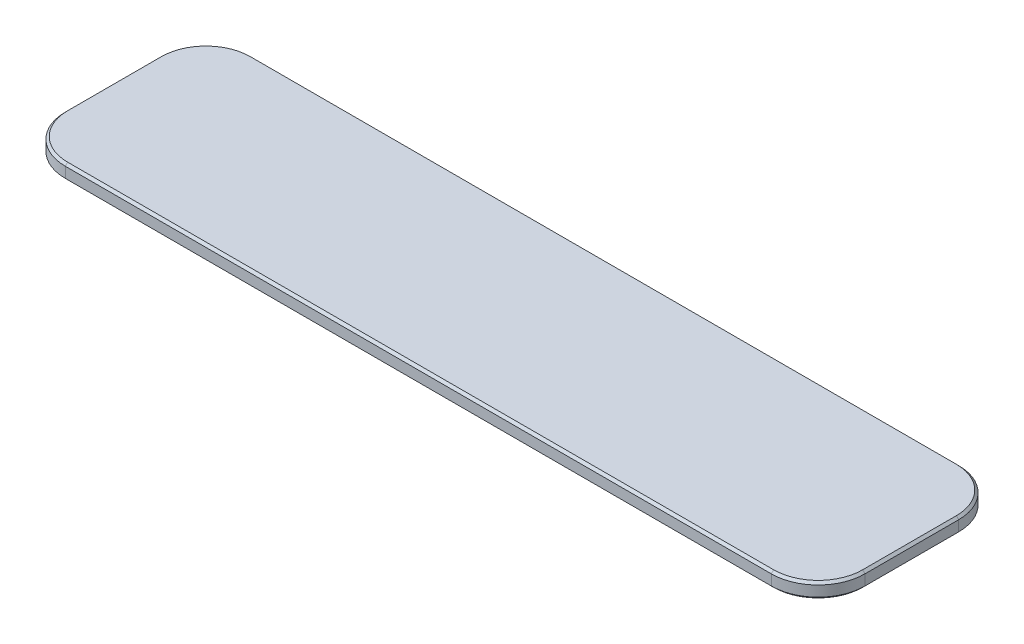
ISO-10303-21;
HEADER;
FILE_DESCRIPTION(('STEP AP214'),'2;1');
FILE_NAME('part.step','',(''),(''),'','','');
FILE_SCHEMA(('AUTOMOTIVE_DESIGN { 1 0 10303 214 1 1 1 1 }'));
ENDSEC;
DATA;
#1=APPLICATION_CONTEXT('core data for automotive mechanical design processes');
#2=APPLICATION_PROTOCOL_DEFINITION('international standard','automotive_design',2000,#1);
#3=PRODUCT_CONTEXT('',#1,'mechanical');
#4=PRODUCT('Part','Part','',(#3));
#5=PRODUCT_RELATED_PRODUCT_CATEGORY('part','',(#4));
#6=PRODUCT_DEFINITION_FORMATION('','',#4);
#7=PRODUCT_DEFINITION_CONTEXT('part definition',#1,'design');
#8=PRODUCT_DEFINITION('design','',#6,#7);
#9=PRODUCT_DEFINITION_SHAPE('','',#8);
#10=(LENGTH_UNIT() NAMED_UNIT(*) SI_UNIT(.MILLI.,.METRE.));
#11=(NAMED_UNIT(*) PLANE_ANGLE_UNIT() SI_UNIT($,.RADIAN.));
#12=(NAMED_UNIT(*) SI_UNIT($,.STERADIAN.) SOLID_ANGLE_UNIT());
#13=UNCERTAINTY_MEASURE_WITH_UNIT(LENGTH_MEASURE(1.E-05),#10,'distance_accuracy_value','');
#14=(GEOMETRIC_REPRESENTATION_CONTEXT(3) GLOBAL_UNCERTAINTY_ASSIGNED_CONTEXT((#13)) GLOBAL_UNIT_ASSIGNED_CONTEXT((#10,
#11,#12)) REPRESENTATION_CONTEXT('',''));
#15=CARTESIAN_POINT('',(0.,0.,0.));
#16=DIRECTION('',(0.,0.,1.));
#17=DIRECTION('',(1.,0.,0.));
#18=AXIS2_PLACEMENT_3D('',#15,#16,#17);
#19=CARTESIAN_POINT('',(170.675,6.5,40.));
#20=DIRECTION('',(-1.,0.,0.));
#21=DIRECTION('',(0.,0.,1.));
#22=AXIS2_PLACEMENT_3D('',#19,#20,#21);
#23=PLANE('',#22);
#24=DIRECTION('',(0.,-1.,0.));
#25=VECTOR('',#24,1.);
#26=CARTESIAN_POINT('',(170.675,6.5,20.));
#27=LINE('',#26,#25);
#28=CARTESIAN_POINT('',(170.675,5.50000000000005,20.));
#29=VERTEX_POINT('',#28);
#30=CARTESIAN_POINT('',(170.675,1.,20.));
#31=VERTEX_POINT('',#30);
#32=EDGE_CURVE('E282',#29,#31,#27,.T.);
#33=ORIENTED_EDGE('',*,*,#32,.T.);
#34=DIRECTION('',(0.,0.,-1.));
#35=VECTOR('',#34,1.);
#36=CARTESIAN_POINT('',(170.675,1.,-20.));
#37=LINE('',#36,#35);
#38=CARTESIAN_POINT('',(170.675,1.,-20.));
#39=VERTEX_POINT('',#38);
#40=EDGE_CURVE('E209',#31,#39,#37,.T.);
#41=ORIENTED_EDGE('',*,*,#40,.T.);
#42=DIRECTION('',(0.,-1.,0.));
#43=VECTOR('',#42,1.);
#44=CARTESIAN_POINT('',(170.675,6.5,-20.));
#45=LINE('',#44,#43);
#46=CARTESIAN_POINT('',(170.675,5.50000000000005,-20.));
#47=VERTEX_POINT('',#46);
#48=EDGE_CURVE('E240',#39,#47,#45,.F.);
#49=ORIENTED_EDGE('',*,*,#48,.T.);
#50=DIRECTION('',(0.,0.,1.));
#51=VECTOR('',#50,1.);
#52=CARTESIAN_POINT('',(170.675,5.50000000000005,40.));
#53=LINE('',#52,#51);
#54=EDGE_CURVE('E207',#47,#29,#53,.T.);
#55=ORIENTED_EDGE('',*,*,#54,.T.);
#56=EDGE_LOOP('',(#33,#41,#49,#55));
#57=FACE_BOUND('',#56,.T.);
#58=ADVANCED_FACE('F34',(#57),#23,.F.);
#59=CARTESIAN_POINT('',(-170.675,6.5,-40.));
#60=DIRECTION('',(0.,0.,1.));
#61=DIRECTION('',(1.,0.,0.));
#62=AXIS2_PLACEMENT_3D('',#59,#60,#61);
#63=PLANE('',#62);
#64=DIRECTION('',(0.,-1.,0.));
#65=VECTOR('',#64,1.);
#66=CARTESIAN_POINT('',(150.675,6.5,-40.));
#67=LINE('',#66,#65);
#68=CARTESIAN_POINT('',(150.675,5.50000000000005,-40.));
#69=VERTEX_POINT('',#68);
#70=CARTESIAN_POINT('',(150.675,1.,-40.));
#71=VERTEX_POINT('',#70);
#72=EDGE_CURVE('E278',#69,#71,#67,.T.);
#73=ORIENTED_EDGE('',*,*,#72,.T.);
#74=DIRECTION('',(-1.,0.,0.));
#75=VECTOR('',#74,1.);
#76=CARTESIAN_POINT('',(-150.675,1.,-40.));
#77=LINE('',#76,#75);
#78=CARTESIAN_POINT('',(-150.675,1.,-40.));
#79=VERTEX_POINT('',#78);
#80=EDGE_CURVE('E184',#71,#79,#77,.T.);
#81=ORIENTED_EDGE('',*,*,#80,.T.);
#82=DIRECTION('',(0.,-1.,0.));
#83=VECTOR('',#82,1.);
#84=CARTESIAN_POINT('',(-150.675,6.5,-40.));
#85=LINE('',#84,#83);
#86=CARTESIAN_POINT('',(-150.675,5.50000000000005,-40.));
#87=VERTEX_POINT('',#86);
#88=EDGE_CURVE('E168',#79,#87,#85,.F.);
#89=ORIENTED_EDGE('',*,*,#88,.T.);
#90=DIRECTION('',(1.,0.,0.));
#91=VECTOR('',#90,1.);
#92=CARTESIAN_POINT('',(-170.675,5.50000000000005,-40.));
#93=LINE('',#92,#91);
#94=EDGE_CURVE('E182',#87,#69,#93,.T.);
#95=ORIENTED_EDGE('',*,*,#94,.T.);
#96=EDGE_LOOP('',(#73,#81,#89,#95));
#97=FACE_BOUND('',#96,.T.);
#98=ADVANCED_FACE('F319',(#97),#63,.F.);
#99=CARTESIAN_POINT('',(-170.675,6.5,40.));
#100=DIRECTION('',(1.,0.,0.));
#101=DIRECTION('',(0.,0.,-1.));
#102=AXIS2_PLACEMENT_3D('',#99,#100,#101);
#103=PLANE('',#102);
#104=DIRECTION('',(0.,-1.,0.));
#105=VECTOR('',#104,1.);
#106=CARTESIAN_POINT('',(-170.675,6.5,-20.));
#107=LINE('',#106,#105);
#108=CARTESIAN_POINT('',(-170.675,5.50000000000005,-20.));
#109=VERTEX_POINT('',#108);
#110=CARTESIAN_POINT('',(-170.675,1.,-20.));
#111=VERTEX_POINT('',#110);
#112=EDGE_CURVE('E295',#109,#111,#107,.T.);
#113=ORIENTED_EDGE('',*,*,#112,.T.);
#114=DIRECTION('',(0.,0.,1.));
#115=VECTOR('',#114,1.);
#116=CARTESIAN_POINT('',(-170.675,1.,20.));
#117=LINE('',#116,#115);
#118=CARTESIAN_POINT('',(-170.675,1.,20.));
#119=VERTEX_POINT('',#118);
#120=EDGE_CURVE('E192',#111,#119,#117,.T.);
#121=ORIENTED_EDGE('',*,*,#120,.T.);
#122=DIRECTION('',(0.,-1.,0.));
#123=VECTOR('',#122,1.);
#124=CARTESIAN_POINT('',(-170.675,6.5,20.));
#125=LINE('',#124,#123);
#126=CARTESIAN_POINT('',(-170.675,5.50000000000005,20.));
#127=VERTEX_POINT('',#126);
#128=EDGE_CURVE('E292',#119,#127,#125,.F.);
#129=ORIENTED_EDGE('',*,*,#128,.T.);
#130=DIRECTION('',(0.,0.,-1.));
#131=VECTOR('',#130,1.);
#132=CARTESIAN_POINT('',(-170.675,5.50000000000005,40.));
#133=LINE('',#132,#131);
#134=EDGE_CURVE('E190',#127,#109,#133,.T.);
#135=ORIENTED_EDGE('',*,*,#134,.T.);
#136=EDGE_LOOP('',(#113,#121,#129,#135));
#137=FACE_BOUND('',#136,.T.);
#138=ADVANCED_FACE('F363',(#137),#103,.F.);
#139=CARTESIAN_POINT('',(-170.675,6.5,40.));
#140=DIRECTION('',(0.,0.,-1.));
#141=DIRECTION('',(-1.,0.,0.));
#142=AXIS2_PLACEMENT_3D('',#139,#140,#141);
#143=PLANE('',#142);
#144=DIRECTION('',(0.,-1.,0.));
#145=VECTOR('',#144,1.);
#146=CARTESIAN_POINT('',(-150.675,6.5,40.));
#147=LINE('',#146,#145);
#148=CARTESIAN_POINT('',(-150.675,5.50000000000005,40.));
#149=VERTEX_POINT('',#148);
#150=CARTESIAN_POINT('',(-150.675,1.,40.));
#151=VERTEX_POINT('',#150);
#152=EDGE_CURVE('E284',#149,#151,#147,.T.);
#153=ORIENTED_EDGE('',*,*,#152,.T.);
#154=DIRECTION('',(1.,0.,0.));
#155=VECTOR('',#154,1.);
#156=CARTESIAN_POINT('',(150.675,1.,40.));
#157=LINE('',#156,#155);
#158=CARTESIAN_POINT('',(150.675,1.,40.));
#159=VERTEX_POINT('',#158);
#160=EDGE_CURVE('E201',#151,#159,#157,.T.);
#161=ORIENTED_EDGE('',*,*,#160,.T.);
#162=DIRECTION('',(0.,-1.,0.));
#163=VECTOR('',#162,1.);
#164=CARTESIAN_POINT('',(150.675,6.5,40.));
#165=LINE('',#164,#163);
#166=CARTESIAN_POINT('',(150.675,5.50000000000005,40.));
#167=VERTEX_POINT('',#166);
#168=EDGE_CURVE('E289',#159,#167,#165,.F.);
#169=ORIENTED_EDGE('',*,*,#168,.T.);
#170=DIRECTION('',(-1.,0.,0.));
#171=VECTOR('',#170,1.);
#172=CARTESIAN_POINT('',(-170.675,5.50000000000005,40.));
#173=LINE('',#172,#171);
#174=EDGE_CURVE('E199',#167,#149,#173,.T.);
#175=ORIENTED_EDGE('',*,*,#174,.T.);
#176=EDGE_LOOP('',(#153,#161,#169,#175));
#177=FACE_BOUND('',#176,.T.);
#178=ADVANCED_FACE('F347',(#177),#143,.F.);
#179=CARTESIAN_POINT('',(0.,6.5,0.));
#180=DIRECTION('',(0.,-1.,0.));
#181=DIRECTION('',(0.,0.,-1.));
#182=AXIS2_PLACEMENT_3D('',#179,#180,#181);
#183=PLANE('',#182);
#184=DIRECTION('',(0.,0.,1.));
#185=VECTOR('',#184,1.);
#186=CARTESIAN_POINT('',(-169.675,6.5,0.));
#187=LINE('',#186,#185);
#188=CARTESIAN_POINT('',(-169.675,6.5,-20.));
#189=VERTEX_POINT('',#188);
#190=CARTESIAN_POINT('',(-169.675,6.5,20.));
#191=VERTEX_POINT('',#190);
#192=EDGE_CURVE('E44',#189,#191,#187,.T.);
#193=ORIENTED_EDGE('',*,*,#192,.T.);
#194=CARTESIAN_POINT('',(-150.675,6.5,20.));
#195=DIRECTION('',(0.,-1.,0.));
#196=DIRECTION('',(0.,0.,-1.));
#197=AXIS2_PLACEMENT_3D('',#194,#195,#196);
#198=CIRCLE('',#197,19.0000000000001);
#199=CARTESIAN_POINT('',(-150.675,6.5,39.0000000000001));
#200=VERTEX_POINT('',#199);
#201=EDGE_CURVE('E11',#191,#200,#198,.F.);
#202=ORIENTED_EDGE('',*,*,#201,.T.);
#203=DIRECTION('',(1.,0.,0.));
#204=VECTOR('',#203,1.);
#205=CARTESIAN_POINT('',(0.,6.5,39.0000000000001));
#206=LINE('',#205,#204);
#207=CARTESIAN_POINT('',(150.675,6.5,39.0000000000001));
#208=VERTEX_POINT('',#207);
#209=EDGE_CURVE('E211',#200,#208,#206,.T.);
#210=ORIENTED_EDGE('',*,*,#209,.T.);
#211=CARTESIAN_POINT('',(150.675,6.5,20.));
#212=DIRECTION('',(0.,-1.,0.));
#213=DIRECTION('',(0.,0.,-1.));
#214=AXIS2_PLACEMENT_3D('',#211,#212,#213);
#215=CIRCLE('',#214,19.);
#216=CARTESIAN_POINT('',(169.675,6.5,20.));
#217=VERTEX_POINT('',#216);
#218=EDGE_CURVE('E213',#208,#217,#215,.F.);
#219=ORIENTED_EDGE('',*,*,#218,.T.);
#220=DIRECTION('',(0.,0.,-1.));
#221=VECTOR('',#220,1.);
#222=CARTESIAN_POINT('',(169.675,6.5,0.));
#223=LINE('',#222,#221);
#224=CARTESIAN_POINT('',(169.675,6.5,-20.));
#225=VERTEX_POINT('',#224);
#226=EDGE_CURVE('E215',#217,#225,#223,.T.);
#227=ORIENTED_EDGE('',*,*,#226,.T.);
#228=CARTESIAN_POINT('',(150.675,6.5,-20.));
#229=DIRECTION('',(0.,-1.,0.));
#230=DIRECTION('',(0.,0.,-1.));
#231=AXIS2_PLACEMENT_3D('',#228,#229,#230);
#232=CIRCLE('',#231,19.0000000000001);
#233=CARTESIAN_POINT('',(150.675,6.5,-39.0000000000001));
#234=VERTEX_POINT('',#233);
#235=EDGE_CURVE('E217',#225,#234,#232,.F.);
#236=ORIENTED_EDGE('',*,*,#235,.T.);
#237=DIRECTION('',(-1.,0.,0.));
#238=VECTOR('',#237,1.);
#239=CARTESIAN_POINT('',(0.,6.5,-39.0000000000001));
#240=LINE('',#239,#238);
#241=CARTESIAN_POINT('',(-150.675,6.5,-39.0000000000001));
#242=VERTEX_POINT('',#241);
#243=EDGE_CURVE('E219',#234,#242,#240,.T.);
#244=ORIENTED_EDGE('',*,*,#243,.T.);
#245=CARTESIAN_POINT('',(-150.675,6.5,-20.));
#246=DIRECTION('',(0.,-1.,0.));
#247=DIRECTION('',(0.,0.,-1.));
#248=AXIS2_PLACEMENT_3D('',#245,#246,#247);
#249=CIRCLE('',#248,19.);
#250=EDGE_CURVE('E55',#242,#189,#249,.F.);
#251=ORIENTED_EDGE('',*,*,#250,.T.);
#252=EDGE_LOOP('',(#193,#202,#210,#219,#227,#236,#244,#251));
#253=FACE_BOUND('',#252,.T.);
#254=ADVANCED_FACE('F335',(#253),#183,.F.);
#255=CARTESIAN_POINT('',(0.,0.,0.));
#256=DIRECTION('',(0.,-1.,0.));
#257=DIRECTION('',(0.,0.,-1.));
#258=AXIS2_PLACEMENT_3D('',#255,#256,#257);
#259=PLANE('',#258);
#260=DIRECTION('',(1.,0.,0.));
#261=VECTOR('',#260,1.);
#262=CARTESIAN_POINT('',(150.675,0.,-39.));
#263=LINE('',#262,#261);
#264=CARTESIAN_POINT('',(-150.675,0.,-39.));
#265=VERTEX_POINT('',#264);
#266=CARTESIAN_POINT('',(150.675,0.,-39.));
#267=VERTEX_POINT('',#266);
#268=EDGE_CURVE('E172',#265,#267,#263,.T.);
#269=ORIENTED_EDGE('',*,*,#268,.T.);
#270=CARTESIAN_POINT('',(150.675,0.,-20.));
#271=DIRECTION('',(0.,-1.,0.));
#272=DIRECTION('',(0.,0.,-1.));
#273=AXIS2_PLACEMENT_3D('',#270,#271,#272);
#274=CIRCLE('',#273,19.);
#275=CARTESIAN_POINT('',(169.675,0.,-20.));
#276=VERTEX_POINT('',#275);
#277=EDGE_CURVE('E153',#267,#276,#274,.T.);
#278=ORIENTED_EDGE('',*,*,#277,.T.);
#279=DIRECTION('',(0.,0.,1.));
#280=VECTOR('',#279,1.);
#281=CARTESIAN_POINT('',(169.675,0.,20.));
#282=LINE('',#281,#280);
#283=CARTESIAN_POINT('',(169.675,0.,20.));
#284=VERTEX_POINT('',#283);
#285=EDGE_CURVE('E161',#276,#284,#282,.T.);
#286=ORIENTED_EDGE('',*,*,#285,.T.);
#287=CARTESIAN_POINT('',(150.675,0.,20.));
#288=DIRECTION('',(0.,-1.,0.));
#289=DIRECTION('',(0.,0.,-1.));
#290=AXIS2_PLACEMENT_3D('',#287,#288,#289);
#291=CIRCLE('',#290,19.);
#292=CARTESIAN_POINT('',(150.675,0.,39.));
#293=VERTEX_POINT('',#292);
#294=EDGE_CURVE('E167',#284,#293,#291,.T.);
#295=ORIENTED_EDGE('',*,*,#294,.T.);
#296=DIRECTION('',(-1.,0.,0.));
#297=VECTOR('',#296,1.);
#298=CARTESIAN_POINT('',(-150.675,0.,39.));
#299=LINE('',#298,#297);
#300=CARTESIAN_POINT('',(-150.675,0.,39.));
#301=VERTEX_POINT('',#300);
#302=EDGE_CURVE('E302',#293,#301,#299,.T.);
#303=ORIENTED_EDGE('',*,*,#302,.T.);
#304=CARTESIAN_POINT('',(-150.675,0.,20.));
#305=DIRECTION('',(0.,-1.,0.));
#306=DIRECTION('',(0.,0.,-1.));
#307=AXIS2_PLACEMENT_3D('',#304,#305,#306);
#308=CIRCLE('',#307,19.);
#309=CARTESIAN_POINT('',(-169.675,0.,20.));
#310=VERTEX_POINT('',#309);
#311=EDGE_CURVE('E304',#301,#310,#308,.T.);
#312=ORIENTED_EDGE('',*,*,#311,.T.);
#313=DIRECTION('',(0.,0.,-1.));
#314=VECTOR('',#313,1.);
#315=CARTESIAN_POINT('',(-169.675,0.,-20.));
#316=LINE('',#315,#314);
#317=CARTESIAN_POINT('',(-169.675,0.,-20.));
#318=VERTEX_POINT('',#317);
#319=EDGE_CURVE('E306',#310,#318,#316,.T.);
#320=ORIENTED_EDGE('',*,*,#319,.T.);
#321=CARTESIAN_POINT('',(-150.675,0.,-20.));
#322=DIRECTION('',(0.,-1.,0.));
#323=DIRECTION('',(0.,0.,-1.));
#324=AXIS2_PLACEMENT_3D('',#321,#322,#323);
#325=CIRCLE('',#324,19.);
#326=EDGE_CURVE('E177',#318,#265,#325,.T.);
#327=ORIENTED_EDGE('',*,*,#326,.T.);
#328=EDGE_LOOP('',(#269,#278,#286,#295,#303,#312,#320,#327));
#329=FACE_BOUND('',#328,.T.);
#330=ADVANCED_FACE('F170',(#329),#259,.T.);
#331=CARTESIAN_POINT('',(150.675,6.5,20.));
#332=DIRECTION('',(0.,-1.,0.));
#333=DIRECTION('',(0.,0.,-1.));
#334=AXIS2_PLACEMENT_3D('',#331,#332,#333);
#335=CYLINDRICAL_SURFACE('',#334,20.);
#336=ORIENTED_EDGE('',*,*,#168,.F.);
#337=CARTESIAN_POINT('',(150.675,1.,20.));
#338=DIRECTION('',(0.,-1.,0.));
#339=DIRECTION('',(0.,0.,-1.));
#340=AXIS2_PLACEMENT_3D('',#337,#338,#339);
#341=CIRCLE('',#340,20.);
#342=EDGE_CURVE('E205',#159,#31,#341,.F.);
#343=ORIENTED_EDGE('',*,*,#342,.T.);
#344=ORIENTED_EDGE('',*,*,#32,.F.);
#345=CARTESIAN_POINT('',(150.675,5.50000000000005,20.));
#346=DIRECTION('',(0.,-1.,0.));
#347=DIRECTION('',(0.,0.,-1.));
#348=AXIS2_PLACEMENT_3D('',#345,#346,#347);
#349=CIRCLE('',#348,20.);
#350=EDGE_CURVE('E203',#29,#167,#349,.T.);
#351=ORIENTED_EDGE('',*,*,#350,.T.);
#352=EDGE_LOOP('',(#336,#343,#344,#351));
#353=FACE_BOUND('',#352,.T.);
#354=ADVANCED_FACE('F377',(#353),#335,.T.);
#355=CARTESIAN_POINT('',(-150.675,6.5,-20.));
#356=DIRECTION('',(0.,-1.,0.));
#357=DIRECTION('',(0.,0.,-1.));
#358=AXIS2_PLACEMENT_3D('',#355,#356,#357);
#359=CYLINDRICAL_SURFACE('',#358,20.);
#360=ORIENTED_EDGE('',*,*,#88,.F.);
#361=CARTESIAN_POINT('',(-150.675,1.,-20.));
#362=DIRECTION('',(0.,-1.,0.));
#363=DIRECTION('',(0.,0.,-1.));
#364=AXIS2_PLACEMENT_3D('',#361,#362,#363);
#365=CIRCLE('',#364,20.);
#366=EDGE_CURVE('E188',#79,#111,#365,.F.);
#367=ORIENTED_EDGE('',*,*,#366,.T.);
#368=ORIENTED_EDGE('',*,*,#112,.F.);
#369=CARTESIAN_POINT('',(-150.675,5.50000000000005,-20.));
#370=DIRECTION('',(0.,-1.,0.));
#371=DIRECTION('',(0.,0.,-1.));
#372=AXIS2_PLACEMENT_3D('',#369,#370,#371);
#373=CIRCLE('',#372,20.);
#374=EDGE_CURVE('E186',#109,#87,#373,.T.);
#375=ORIENTED_EDGE('',*,*,#374,.T.);
#376=EDGE_LOOP('',(#360,#367,#368,#375));
#377=FACE_BOUND('',#376,.T.);
#378=ADVANCED_FACE('F321',(#377),#359,.T.);
#379=CARTESIAN_POINT('',(150.675,6.5,-20.));
#380=DIRECTION('',(0.,-1.,0.));
#381=DIRECTION('',(0.,0.,-1.));
#382=AXIS2_PLACEMENT_3D('',#379,#380,#381);
#383=CYLINDRICAL_SURFACE('',#382,20.);
#384=ORIENTED_EDGE('',*,*,#48,.F.);
#385=CARTESIAN_POINT('',(150.675,1.,-20.));
#386=DIRECTION('',(0.,-1.,0.));
#387=DIRECTION('',(0.,0.,-1.));
#388=AXIS2_PLACEMENT_3D('',#385,#386,#387);
#389=CIRCLE('',#388,20.);
#390=EDGE_CURVE('E155',#39,#71,#389,.F.);
#391=ORIENTED_EDGE('',*,*,#390,.T.);
#392=ORIENTED_EDGE('',*,*,#72,.F.);
#393=CARTESIAN_POINT('',(150.675,5.50000000000005,-20.));
#394=DIRECTION('',(0.,-1.,0.));
#395=DIRECTION('',(0.,0.,-1.));
#396=AXIS2_PLACEMENT_3D('',#393,#394,#395);
#397=CIRCLE('',#396,20.);
#398=EDGE_CURVE('E174',#69,#47,#397,.T.);
#399=ORIENTED_EDGE('',*,*,#398,.T.);
#400=EDGE_LOOP('',(#384,#391,#392,#399));
#401=FACE_BOUND('',#400,.T.);
#402=ADVANCED_FACE('F276',(#401),#383,.T.);
#403=CARTESIAN_POINT('',(-150.675,6.5,20.));
#404=DIRECTION('',(0.,-1.,0.));
#405=DIRECTION('',(0.,0.,-1.));
#406=AXIS2_PLACEMENT_3D('',#403,#404,#405);
#407=CYLINDRICAL_SURFACE('',#406,20.);
#408=ORIENTED_EDGE('',*,*,#128,.F.);
#409=CARTESIAN_POINT('',(-150.675,1.,20.));
#410=DIRECTION('',(0.,-1.,0.));
#411=DIRECTION('',(0.,0.,-1.));
#412=AXIS2_PLACEMENT_3D('',#409,#410,#411);
#413=CIRCLE('',#412,20.);
#414=EDGE_CURVE('E197',#119,#151,#413,.F.);
#415=ORIENTED_EDGE('',*,*,#414,.T.);
#416=ORIENTED_EDGE('',*,*,#152,.F.);
#417=CARTESIAN_POINT('',(-150.675,5.50000000000005,20.));
#418=DIRECTION('',(0.,-1.,0.));
#419=DIRECTION('',(0.,0.,-1.));
#420=AXIS2_PLACEMENT_3D('',#417,#418,#419);
#421=CIRCLE('',#420,20.);
#422=EDGE_CURVE('E194',#149,#127,#421,.T.);
#423=ORIENTED_EDGE('',*,*,#422,.T.);
#424=EDGE_LOOP('',(#408,#415,#416,#423));
#425=FACE_BOUND('',#424,.T.);
#426=ADVANCED_FACE('F352',(#425),#407,.T.);
#427=CARTESIAN_POINT('',(-150.675,0.,20.));
#428=DIRECTION('',(0.,1.,0.));
#429=DIRECTION('',(0.,0.,1.));
#430=AXIS2_PLACEMENT_3D('',#427,#428,#429);
#431=CONICAL_SURFACE('',#430,19.,0.78539816339745);
#432=DIRECTION('',(0.,-0.707106781186545,-0.70710678118655));
#433=VECTOR('',#432,1.);
#434=CARTESIAN_POINT('',(-150.675,1.,40.));
#435=LINE('',#434,#433);
#436=EDGE_CURVE('E234',#151,#301,#435,.T.);
#437=ORIENTED_EDGE('',*,*,#436,.F.);
#438=ORIENTED_EDGE('',*,*,#414,.F.);
#439=DIRECTION('',(-0.707106781186547,0.707106781186547,0.));
#440=VECTOR('',#439,1.);
#441=CARTESIAN_POINT('',(-169.675,0.,20.));
#442=LINE('',#441,#440);
#443=EDGE_CURVE('E237',#310,#119,#442,.T.);
#444=ORIENTED_EDGE('',*,*,#443,.F.);
#445=ORIENTED_EDGE('',*,*,#311,.F.);
#446=EDGE_LOOP('',(#437,#438,#444,#445));
#447=FACE_BOUND('',#446,.T.);
#448=ADVANCED_FACE('F356',(#447),#431,.T.);
#449=CARTESIAN_POINT('',(-170.675,1.,40.));
#450=DIRECTION('',(-0.707106781186547,-0.707106781186547,0.));
#451=DIRECTION('',(0.,0.,-1.));
#452=AXIS2_PLACEMENT_3D('',#449,#450,#451);
#453=PLANE('',#452);
#454=ORIENTED_EDGE('',*,*,#443,.T.);
#455=ORIENTED_EDGE('',*,*,#120,.F.);
#456=DIRECTION('',(-0.707106781186547,0.707106781186547,0.));
#457=VECTOR('',#456,1.);
#458=CARTESIAN_POINT('',(-169.675,0.,-20.));
#459=LINE('',#458,#457);
#460=EDGE_CURVE('E231',#318,#111,#459,.T.);
#461=ORIENTED_EDGE('',*,*,#460,.F.);
#462=ORIENTED_EDGE('',*,*,#319,.F.);
#463=EDGE_LOOP('',(#454,#455,#461,#462));
#464=FACE_BOUND('',#463,.T.);
#465=ADVANCED_FACE('F361',(#464),#453,.T.);
#466=CARTESIAN_POINT('',(-170.675,1.,40.));
#467=DIRECTION('',(0.,-0.707106781186547,0.707106781186547));
#468=DIRECTION('',(-1.,0.,0.));
#469=AXIS2_PLACEMENT_3D('',#466,#467,#468);
#470=PLANE('',#469);
#471=ORIENTED_EDGE('',*,*,#436,.T.);
#472=ORIENTED_EDGE('',*,*,#302,.F.);
#473=DIRECTION('',(0.,-0.707106781186547,-0.707106781186547));
#474=VECTOR('',#473,1.);
#475=CARTESIAN_POINT('',(150.675,1.,40.));
#476=LINE('',#475,#474);
#477=EDGE_CURVE('E228',#159,#293,#476,.T.);
#478=ORIENTED_EDGE('',*,*,#477,.F.);
#479=ORIENTED_EDGE('',*,*,#160,.F.);
#480=EDGE_LOOP('',(#471,#472,#478,#479));
#481=FACE_BOUND('',#480,.T.);
#482=ADVANCED_FACE('F415',(#481),#470,.T.);
#483=CARTESIAN_POINT('',(-150.675,0.,-20.));
#484=DIRECTION('',(0.,1.,0.));
#485=DIRECTION('',(0.,0.,1.));
#486=AXIS2_PLACEMENT_3D('',#483,#484,#485);
#487=CONICAL_SURFACE('',#486,19.,0.785398163397454);
#488=ORIENTED_EDGE('',*,*,#460,.T.);
#489=ORIENTED_EDGE('',*,*,#366,.F.);
#490=DIRECTION('',(0.,0.707106781186545,-0.70710678118655));
#491=VECTOR('',#490,1.);
#492=CARTESIAN_POINT('',(-150.675,0.,-39.));
#493=LINE('',#492,#491);
#494=EDGE_CURVE('E225',#265,#79,#493,.T.);
#495=ORIENTED_EDGE('',*,*,#494,.F.);
#496=ORIENTED_EDGE('',*,*,#326,.F.);
#497=EDGE_LOOP('',(#488,#489,#495,#496));
#498=FACE_BOUND('',#497,.T.);
#499=ADVANCED_FACE('F313',(#498),#487,.T.);
#500=CARTESIAN_POINT('',(150.675,0.,20.));
#501=DIRECTION('',(0.,1.,0.));
#502=DIRECTION('',(0.,0.,1.));
#503=AXIS2_PLACEMENT_3D('',#500,#501,#502);
#504=CONICAL_SURFACE('',#503,19.,0.785398163397454);
#505=ORIENTED_EDGE('',*,*,#477,.T.);
#506=ORIENTED_EDGE('',*,*,#294,.F.);
#507=DIRECTION('',(-0.707106781186547,-0.707106781186547,0.));
#508=VECTOR('',#507,1.);
#509=CARTESIAN_POINT('',(170.675,1.,20.));
#510=LINE('',#509,#508);
#511=EDGE_CURVE('E164',#31,#284,#510,.T.);
#512=ORIENTED_EDGE('',*,*,#511,.F.);
#513=ORIENTED_EDGE('',*,*,#342,.F.);
#514=EDGE_LOOP('',(#505,#506,#512,#513));
#515=FACE_BOUND('',#514,.T.);
#516=ADVANCED_FACE('F403',(#515),#504,.T.);
#517=CARTESIAN_POINT('',(-170.675,1.,-40.));
#518=DIRECTION('',(0.,-0.707106781186547,-0.707106781186547));
#519=DIRECTION('',(1.,0.,0.));
#520=AXIS2_PLACEMENT_3D('',#517,#518,#519);
#521=PLANE('',#520);
#522=ORIENTED_EDGE('',*,*,#494,.T.);
#523=ORIENTED_EDGE('',*,*,#80,.F.);
#524=DIRECTION('',(0.,0.707106781186547,-0.707106781186547));
#525=VECTOR('',#524,1.);
#526=CARTESIAN_POINT('',(150.675,0.,-39.));
#527=LINE('',#526,#525);
#528=EDGE_CURVE('E158',#267,#71,#527,.T.);
#529=ORIENTED_EDGE('',*,*,#528,.F.);
#530=ORIENTED_EDGE('',*,*,#268,.F.);
#531=EDGE_LOOP('',(#522,#523,#529,#530));
#532=FACE_BOUND('',#531,.T.);
#533=ADVANCED_FACE('F316',(#532),#521,.T.);
#534=CARTESIAN_POINT('',(170.675,1.,40.));
#535=DIRECTION('',(0.707106781186547,-0.707106781186547,0.));
#536=DIRECTION('',(0.,0.,1.));
#537=AXIS2_PLACEMENT_3D('',#534,#535,#536);
#538=PLANE('',#537);
#539=ORIENTED_EDGE('',*,*,#511,.T.);
#540=ORIENTED_EDGE('',*,*,#285,.F.);
#541=DIRECTION('',(-0.707106781186547,-0.707106781186547,0.));
#542=VECTOR('',#541,1.);
#543=CARTESIAN_POINT('',(170.675,1.,-20.));
#544=LINE('',#543,#542);
#545=EDGE_CURVE('E149',#39,#276,#544,.T.);
#546=ORIENTED_EDGE('',*,*,#545,.F.);
#547=ORIENTED_EDGE('',*,*,#40,.F.);
#548=EDGE_LOOP('',(#539,#540,#546,#547));
#549=FACE_BOUND('',#548,.T.);
#550=ADVANCED_FACE('F162',(#549),#538,.T.);
#551=CARTESIAN_POINT('',(150.675,0.,-20.));
#552=DIRECTION('',(0.,1.,0.));
#553=DIRECTION('',(0.,0.,1.));
#554=AXIS2_PLACEMENT_3D('',#551,#552,#553);
#555=CONICAL_SURFACE('',#554,19.,0.78539816339745);
#556=ORIENTED_EDGE('',*,*,#528,.T.);
#557=ORIENTED_EDGE('',*,*,#390,.F.);
#558=ORIENTED_EDGE('',*,*,#545,.T.);
#559=ORIENTED_EDGE('',*,*,#277,.F.);
#560=EDGE_LOOP('',(#556,#557,#558,#559));
#561=FACE_BOUND('',#560,.T.);
#562=ADVANCED_FACE('F151',(#561),#555,.T.);
#563=CARTESIAN_POINT('',(150.675,6.5,-20.));
#564=DIRECTION('',(0.,-1.,0.));
#565=DIRECTION('',(0.,0.,-1.));
#566=AXIS2_PLACEMENT_3D('',#563,#564,#565);
#567=CONICAL_SURFACE('',#566,19.0000000000001,0.78539816339745);
#568=DIRECTION('',(-0.707106781186547,0.707106781186547,0.));
#569=VECTOR('',#568,1.);
#570=CARTESIAN_POINT('',(170.675,5.50000000000005,-20.));
#571=LINE('',#570,#569);
#572=EDGE_CURVE('E256',#47,#225,#571,.T.);
#573=ORIENTED_EDGE('',*,*,#572,.F.);
#574=ORIENTED_EDGE('',*,*,#398,.F.);
#575=DIRECTION('',(0.,-0.707106781186547,-0.707106781186547));
#576=VECTOR('',#575,1.);
#577=CARTESIAN_POINT('',(150.675,6.5,-39.0000000000001));
#578=LINE('',#577,#576);
#579=EDGE_CURVE('E39',#234,#69,#578,.T.);
#580=ORIENTED_EDGE('',*,*,#579,.F.);
#581=ORIENTED_EDGE('',*,*,#235,.F.);
#582=EDGE_LOOP('',(#573,#574,#580,#581));
#583=FACE_BOUND('',#582,.T.);
#584=ADVANCED_FACE('F37',(#583),#567,.T.);
#585=CARTESIAN_POINT('',(0.,6.5,-39.0000000000001));
#586=DIRECTION('',(0.,-0.707106781186547,0.707106781186547));
#587=DIRECTION('',(-1.,0.,0.));
#588=AXIS2_PLACEMENT_3D('',#585,#586,#587);
#589=PLANE('',#588);
#590=ORIENTED_EDGE('',*,*,#579,.T.);
#591=ORIENTED_EDGE('',*,*,#94,.F.);
#592=DIRECTION('',(0.,-0.707106781186547,-0.707106781186547));
#593=VECTOR('',#592,1.);
#594=CARTESIAN_POINT('',(-150.675,6.5,-39.0000000000001));
#595=LINE('',#594,#593);
#596=EDGE_CURVE('E254',#242,#87,#595,.T.);
#597=ORIENTED_EDGE('',*,*,#596,.F.);
#598=ORIENTED_EDGE('',*,*,#243,.F.);
#599=EDGE_LOOP('',(#590,#591,#597,#598));
#600=FACE_BOUND('',#599,.T.);
#601=ADVANCED_FACE('F267',(#600),#589,.F.);
#602=CARTESIAN_POINT('',(169.675,6.5,0.));
#603=DIRECTION('',(-0.707106781186547,-0.707106781186547,0.));
#604=DIRECTION('',(0.,0.,-1.));
#605=AXIS2_PLACEMENT_3D('',#602,#603,#604);
#606=PLANE('',#605);
#607=ORIENTED_EDGE('',*,*,#572,.T.);
#608=ORIENTED_EDGE('',*,*,#226,.F.);
#609=DIRECTION('',(-0.707106781186547,0.707106781186547,0.));
#610=VECTOR('',#609,1.);
#611=CARTESIAN_POINT('',(170.675,5.50000000000005,20.));
#612=LINE('',#611,#610);
#613=EDGE_CURVE('E251',#29,#217,#612,.T.);
#614=ORIENTED_EDGE('',*,*,#613,.F.);
#615=ORIENTED_EDGE('',*,*,#54,.F.);
#616=EDGE_LOOP('',(#607,#608,#614,#615));
#617=FACE_BOUND('',#616,.T.);
#618=ADVANCED_FACE('F457',(#617),#606,.F.);
#619=CARTESIAN_POINT('',(-150.675,6.5,-20.));
#620=DIRECTION('',(0.,-1.,0.));
#621=DIRECTION('',(0.,0.,-1.));
#622=AXIS2_PLACEMENT_3D('',#619,#620,#621);
#623=CONICAL_SURFACE('',#622,19.,0.785398163397453);
#624=ORIENTED_EDGE('',*,*,#596,.T.);
#625=ORIENTED_EDGE('',*,*,#374,.F.);
#626=DIRECTION('',(-0.707106781186547,-0.707106781186547,0.));
#627=VECTOR('',#626,1.);
#628=CARTESIAN_POINT('',(-169.675,6.5,-20.));
#629=LINE('',#628,#627);
#630=EDGE_CURVE('E248',#189,#109,#629,.T.);
#631=ORIENTED_EDGE('',*,*,#630,.F.);
#632=ORIENTED_EDGE('',*,*,#250,.F.);
#633=EDGE_LOOP('',(#624,#625,#631,#632));
#634=FACE_BOUND('',#633,.T.);
#635=ADVANCED_FACE('F325',(#634),#623,.T.);
#636=CARTESIAN_POINT('',(150.675,6.5,20.));
#637=DIRECTION('',(0.,-1.,0.));
#638=DIRECTION('',(0.,0.,-1.));
#639=AXIS2_PLACEMENT_3D('',#636,#637,#638);
#640=CONICAL_SURFACE('',#639,19.,0.785398163397453);
#641=ORIENTED_EDGE('',*,*,#613,.T.);
#642=ORIENTED_EDGE('',*,*,#218,.F.);
#643=DIRECTION('',(0.,0.707106781186545,-0.70710678118655));
#644=VECTOR('',#643,1.);
#645=CARTESIAN_POINT('',(150.675,5.50000000000005,40.));
#646=LINE('',#645,#644);
#647=EDGE_CURVE('E245',#167,#208,#646,.T.);
#648=ORIENTED_EDGE('',*,*,#647,.F.);
#649=ORIENTED_EDGE('',*,*,#350,.F.);
#650=EDGE_LOOP('',(#641,#642,#648,#649));
#651=FACE_BOUND('',#650,.T.);
#652=ADVANCED_FACE('F340',(#651),#640,.T.);
#653=CARTESIAN_POINT('',(-169.675,6.5,0.));
#654=DIRECTION('',(0.707106781186547,-0.707106781186547,0.));
#655=DIRECTION('',(0.,0.,1.));
#656=AXIS2_PLACEMENT_3D('',#653,#654,#655);
#657=PLANE('',#656);
#658=ORIENTED_EDGE('',*,*,#630,.T.);
#659=ORIENTED_EDGE('',*,*,#134,.F.);
#660=DIRECTION('',(-0.707106781186547,-0.707106781186547,0.));
#661=VECTOR('',#660,1.);
#662=CARTESIAN_POINT('',(-169.675,6.5,20.));
#663=LINE('',#662,#661);
#664=EDGE_CURVE('E243',#191,#127,#663,.T.);
#665=ORIENTED_EDGE('',*,*,#664,.F.);
#666=ORIENTED_EDGE('',*,*,#192,.F.);
#667=EDGE_LOOP('',(#658,#659,#665,#666));
#668=FACE_BOUND('',#667,.T.);
#669=ADVANCED_FACE('F328',(#668),#657,.F.);
#670=CARTESIAN_POINT('',(0.,6.5,39.0000000000001));
#671=DIRECTION('',(0.,-0.707106781186547,-0.707106781186547));
#672=DIRECTION('',(1.,0.,0.));
#673=AXIS2_PLACEMENT_3D('',#670,#671,#672);
#674=PLANE('',#673);
#675=ORIENTED_EDGE('',*,*,#647,.T.);
#676=ORIENTED_EDGE('',*,*,#209,.F.);
#677=DIRECTION('',(0.,0.707106781186547,-0.707106781186547));
#678=VECTOR('',#677,1.);
#679=CARTESIAN_POINT('',(-150.675,5.50000000000005,40.));
#680=LINE('',#679,#678);
#681=EDGE_CURVE('E241',#149,#200,#680,.T.);
#682=ORIENTED_EDGE('',*,*,#681,.F.);
#683=ORIENTED_EDGE('',*,*,#174,.F.);
#684=EDGE_LOOP('',(#675,#676,#682,#683));
#685=FACE_BOUND('',#684,.T.);
#686=ADVANCED_FACE('F344',(#685),#674,.F.);
#687=CARTESIAN_POINT('',(-150.675,6.5,20.));
#688=DIRECTION('',(0.,-1.,0.));
#689=DIRECTION('',(0.,0.,-1.));
#690=AXIS2_PLACEMENT_3D('',#687,#688,#689);
#691=CONICAL_SURFACE('',#690,19.0000000000001,0.78539816339745);
#692=ORIENTED_EDGE('',*,*,#664,.T.);
#693=ORIENTED_EDGE('',*,*,#422,.F.);
#694=ORIENTED_EDGE('',*,*,#681,.T.);
#695=ORIENTED_EDGE('',*,*,#201,.F.);
#696=EDGE_LOOP('',(#692,#693,#694,#695));
#697=FACE_BOUND('',#696,.T.);
#698=ADVANCED_FACE('F332',(#697),#691,.T.);
#699=CLOSED_SHELL('',(#58,#98,#138,#178,#254,#330,#354,#378,#402,#426,#448,#465,#482,#499,#516,
#533,#550,#562,#584,#601,#618,#635,#652,#669,#686,#698));
#700=MANIFOLD_SOLID_BREP('B2',#699);
#701=ADVANCED_BREP_SHAPE_REPRESENTATION('',(#18,#700),#14);
#702=SHAPE_DEFINITION_REPRESENTATION(#9,#701);
ENDSEC;
END-ISO-10303-21;
